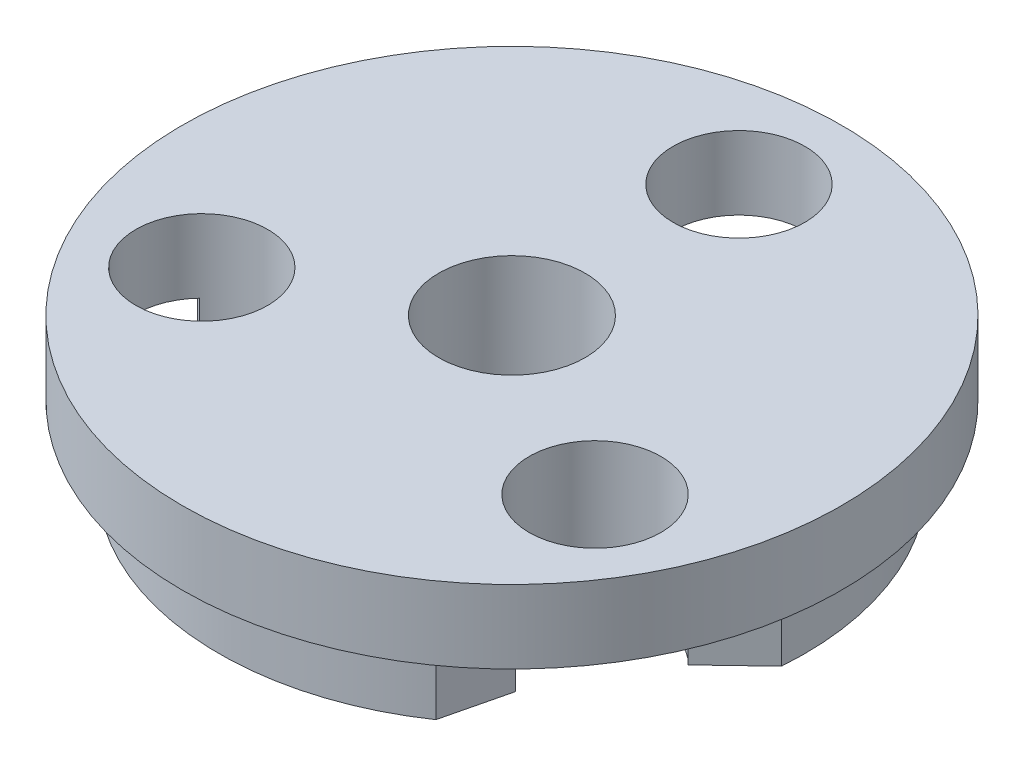
ISO-10303-21;
HEADER;
FILE_DESCRIPTION(('STEP AP214'),'2;1');
FILE_NAME('part.step','',(''),(''),'','','');
FILE_SCHEMA(('AUTOMOTIVE_DESIGN { 1 0 10303 214 1 1 1 1 }'));
ENDSEC;
DATA;
#1=APPLICATION_CONTEXT('core data for automotive mechanical design processes');
#2=APPLICATION_PROTOCOL_DEFINITION('international standard','automotive_design',2000,#1);
#3=PRODUCT_CONTEXT('',#1,'mechanical');
#4=PRODUCT('Part','Part','',(#3));
#5=PRODUCT_RELATED_PRODUCT_CATEGORY('part','',(#4));
#6=PRODUCT_DEFINITION_FORMATION('','',#4);
#7=PRODUCT_DEFINITION_CONTEXT('part definition',#1,'design');
#8=PRODUCT_DEFINITION('design','',#6,#7);
#9=PRODUCT_DEFINITION_SHAPE('','',#8);
#10=(LENGTH_UNIT() NAMED_UNIT(*) SI_UNIT(.MILLI.,.METRE.));
#11=(NAMED_UNIT(*) PLANE_ANGLE_UNIT() SI_UNIT($,.RADIAN.));
#12=(NAMED_UNIT(*) SI_UNIT($,.STERADIAN.) SOLID_ANGLE_UNIT());
#13=UNCERTAINTY_MEASURE_WITH_UNIT(LENGTH_MEASURE(1.E-05),#10,'distance_accuracy_value','');
#14=(GEOMETRIC_REPRESENTATION_CONTEXT(3) GLOBAL_UNCERTAINTY_ASSIGNED_CONTEXT((#13)) GLOBAL_UNIT_ASSIGNED_CONTEXT((#10,
#11,#12)) REPRESENTATION_CONTEXT('',''));
#15=CARTESIAN_POINT('',(0.,0.,0.));
#16=DIRECTION('',(0.,0.,1.));
#17=DIRECTION('',(1.,0.,0.));
#18=AXIS2_PLACEMENT_3D('',#15,#16,#17);
#19=CARTESIAN_POINT('',(0.,-3.5,-15.5));
#20=DIRECTION('',(0.,1.,0.));
#21=DIRECTION('',(0.,0.,1.));
#22=AXIS2_PLACEMENT_3D('',#19,#20,#21);
#23=CYLINDRICAL_SURFACE('',#22,9.);
#24=CARTESIAN_POINT('',(0.,-3.5,-15.5));
#25=DIRECTION('',(0.,-1.,0.));
#26=DIRECTION('',(0.,0.,1.));
#27=AXIS2_PLACEMENT_3D('',#24,#25,#26);
#28=CIRCLE('',#27,9.);
#29=CARTESIAN_POINT('',(8.63404662868259,-3.5,-18.0403225806451));
#30=VERTEX_POINT('',#29);
#31=CARTESIAN_POINT('',(-8.63404662868249,-3.5,-18.0403225806452));
#32=VERTEX_POINT('',#31);
#33=EDGE_CURVE('E150',#30,#32,#28,.T.);
#34=ORIENTED_EDGE('',*,*,#33,.F.);
#35=DIRECTION('',(0.,1.,0.));
#36=VECTOR('',#35,1.);
#37=CARTESIAN_POINT('',(8.63404662868259,-8.5,-18.0403225806451));
#38=LINE('',#37,#36);
#39=CARTESIAN_POINT('',(8.63404662868259,-8.5,-18.0403225806451));
#40=VERTEX_POINT('',#39);
#41=EDGE_CURVE('E11',#40,#30,#38,.T.);
#42=ORIENTED_EDGE('',*,*,#41,.F.);
#43=CARTESIAN_POINT('',(0.,-8.5,-15.5));
#44=DIRECTION('',(0.,-1.,0.));
#45=DIRECTION('',(0.,0.,-1.));
#46=AXIS2_PLACEMENT_3D('',#43,#44,#45);
#47=CIRCLE('',#46,9.);
#48=CARTESIAN_POINT('',(-8.63404662868249,-8.5,-18.0403225806452));
#49=VERTEX_POINT('',#48);
#50=EDGE_CURVE('E181',#49,#40,#47,.F.);
#51=ORIENTED_EDGE('',*,*,#50,.F.);
#52=DIRECTION('',(0.,1.,0.));
#53=VECTOR('',#52,1.);
#54=CARTESIAN_POINT('',(-8.63404662868249,-8.5,-18.0403225806452));
#55=LINE('',#54,#53);
#56=EDGE_CURVE('E190',#49,#32,#55,.T.);
#57=ORIENTED_EDGE('',*,*,#56,.T.);
#58=EDGE_LOOP('',(#34,#42,#51,#57));
#59=FACE_BOUND('',#58,.T.);
#60=ADVANCED_FACE('F35',(#59),#23,.F.);
#61=CARTESIAN_POINT('',(0.,-3.5,0.));
#62=DIRECTION('',(0.,1.,0.));
#63=DIRECTION('',(0.,0.,1.));
#64=AXIS2_PLACEMENT_3D('',#61,#62,#63);
#65=CYLINDRICAL_SURFACE('',#64,5.);
#66=CARTESIAN_POINT('',(0.,-8.5,0.));
#67=DIRECTION('',(0.,-1.,0.));
#68=DIRECTION('',(0.,0.,-1.));
#69=AXIS2_PLACEMENT_3D('',#66,#67,#68);
#70=CIRCLE('',#69,5.);
#71=CARTESIAN_POINT('',(0.,-8.5,-5.));
#72=VERTEX_POINT('',#71);
#73=EDGE_CURVE('E178',#72,#72,#70,.F.);
#74=ORIENTED_EDGE('',*,*,#73,.F.);
#75=EDGE_LOOP('',(#74));
#76=FACE_BOUND('',#75,.T.);
#77=CARTESIAN_POINT('',(0.,1.5,0.));
#78=DIRECTION('',(0.,1.,0.));
#79=DIRECTION('',(0.,0.,1.));
#80=AXIS2_PLACEMENT_3D('',#77,#78,#79);
#81=CIRCLE('',#80,5.);
#82=CARTESIAN_POINT('',(0.,1.5,5.));
#83=VERTEX_POINT('',#82);
#84=EDGE_CURVE('E394',#83,#83,#81,.F.);
#85=ORIENTED_EDGE('',*,*,#84,.F.);
#86=EDGE_LOOP('',(#85));
#87=FACE_BOUND('',#86,.T.);
#88=ADVANCED_FACE('F238',(#76,#87),#65,.F.);
#89=CARTESIAN_POINT('',(0.,-8.5,0.));
#90=DIRECTION('',(0.,1.,0.));
#91=DIRECTION('',(0.,0.,1.));
#92=AXIS2_PLACEMENT_3D('',#89,#90,#91);
#93=CYLINDRICAL_SURFACE('',#92,20.);
#94=CARTESIAN_POINT('',(0.,-3.5,0.));
#95=DIRECTION('',(0.,-1.,0.));
#96=DIRECTION('',(0.,0.,-1.));
#97=AXIS2_PLACEMENT_3D('',#94,#95,#96);
#98=CIRCLE('',#97,20.);
#99=CARTESIAN_POINT('',(19.9404009616461,-3.5,1.54285757242257));
#100=VERTEX_POINT('',#99);
#101=EDGE_CURVE('E176',#30,#100,#98,.T.);
#102=ORIENTED_EDGE('',*,*,#101,.T.);
#103=DIRECTION('',(0.,1.,0.));
#104=VECTOR('',#103,1.);
#105=CARTESIAN_POINT('',(19.9404009616461,-8.5,1.54285757242258));
#106=LINE('',#105,#104);
#107=CARTESIAN_POINT('',(19.9404009616461,-8.5,1.54285757242258));
#108=VERTEX_POINT('',#107);
#109=EDGE_CURVE('E42',#108,#100,#106,.T.);
#110=ORIENTED_EDGE('',*,*,#109,.F.);
#111=CARTESIAN_POINT('',(0.,-8.5,0.));
#112=DIRECTION('',(0.,-1.,0.));
#113=DIRECTION('',(0.,0.,-1.));
#114=AXIS2_PLACEMENT_3D('',#111,#112,#113);
#115=CIRCLE('',#114,20.);
#116=EDGE_CURVE('E183',#40,#108,#115,.T.);
#117=ORIENTED_EDGE('',*,*,#116,.F.);
#118=ORIENTED_EDGE('',*,*,#41,.T.);
#119=EDGE_LOOP('',(#102,#110,#117,#118));
#120=FACE_BOUND('',#119,.T.);
#121=ADVANCED_FACE('F205',(#120),#93,.T.);
#122=CARTESIAN_POINT('',(11.3063543329644,-3.5,16.4974650082204));
#123=VERTEX_POINT('',#122);
#124=CARTESIAN_POINT('',(-11.3063543329626,-3.5,16.4974650082217));
#125=VERTEX_POINT('',#124);
#126=EDGE_CURVE('E189',#123,#125,#98,.T.);
#127=ORIENTED_EDGE('',*,*,#126,.T.);
#128=DIRECTION('',(0.,1.,0.));
#129=VECTOR('',#128,1.);
#130=CARTESIAN_POINT('',(-11.3063543329626,-8.5,16.4974650082217));
#131=LINE('',#130,#129);
#132=CARTESIAN_POINT('',(-11.3063543329626,-8.5,16.4974650082217));
#133=VERTEX_POINT('',#132);
#134=EDGE_CURVE('E195',#133,#125,#131,.T.);
#135=ORIENTED_EDGE('',*,*,#134,.F.);
#136=CARTESIAN_POINT('',(11.3063543329644,-8.5,16.4974650082204));
#137=VERTEX_POINT('',#136);
#138=EDGE_CURVE('E186',#137,#133,#115,.T.);
#139=ORIENTED_EDGE('',*,*,#138,.F.);
#140=DIRECTION('',(0.,1.,0.));
#141=VECTOR('',#140,1.);
#142=CARTESIAN_POINT('',(11.3063543329644,-8.5,16.4974650082204));
#143=LINE('',#142,#141);
#144=EDGE_CURVE('E197',#137,#123,#143,.T.);
#145=ORIENTED_EDGE('',*,*,#144,.T.);
#146=EDGE_LOOP('',(#127,#135,#139,#145));
#147=FACE_BOUND('',#146,.T.);
#148=ADVANCED_FACE('F223',(#147),#93,.T.);
#149=CARTESIAN_POINT('',(-19.9404009616459,-3.5,1.54285757242564));
#150=VERTEX_POINT('',#149);
#151=EDGE_CURVE('E128',#150,#32,#98,.T.);
#152=ORIENTED_EDGE('',*,*,#151,.T.);
#153=ORIENTED_EDGE('',*,*,#56,.F.);
#154=CARTESIAN_POINT('',(-19.9404009616459,-8.5,1.54285757242565));
#155=VERTEX_POINT('',#154);
#156=EDGE_CURVE('E49',#155,#49,#115,.T.);
#157=ORIENTED_EDGE('',*,*,#156,.F.);
#158=DIRECTION('',(0.,1.,0.));
#159=VECTOR('',#158,1.);
#160=CARTESIAN_POINT('',(-19.9404009616459,-8.5,1.54285757242565));
#161=LINE('',#160,#159);
#162=EDGE_CURVE('E193',#155,#150,#161,.T.);
#163=ORIENTED_EDGE('',*,*,#162,.T.);
#164=EDGE_LOOP('',(#152,#153,#157,#163));
#165=FACE_BOUND('',#164,.T.);
#166=ADVANCED_FACE('F219',(#165),#93,.T.);
#167=CARTESIAN_POINT('',(0.,-8.5,0.));
#168=DIRECTION('',(0.,-1.,0.));
#169=DIRECTION('',(0.,0.,-1.));
#170=AXIS2_PLACEMENT_3D('',#167,#168,#169);
#171=PLANE('',#170);
#172=ORIENTED_EDGE('',*,*,#73,.T.);
#173=EDGE_LOOP('',(#172));
#174=FACE_BOUND('',#173,.T.);
#175=ORIENTED_EDGE('',*,*,#50,.T.);
#176=ORIENTED_EDGE('',*,*,#116,.T.);
#177=DIRECTION('',(0.724111911442924,0.,-0.689682491952982));
#178=VECTOR('',#177,1.);
#179=CARTESIAN_POINT('',(10.2554041460978,-8.5,10.767360902293));
#180=LINE('',#179,#178);
#181=CARTESIAN_POINT('',(16.681897360153,-8.5,4.646428786211));
#182=VERTEX_POINT('',#181);
#183=EDGE_CURVE('E157',#182,#108,#180,.T.);
#184=ORIENTED_EDGE('',*,*,#183,.F.);
#185=CARTESIAN_POINT('',(13.4233937586598,-8.5,7.74999999999943));
#186=DIRECTION('',(0.,-1.,0.));
#187=DIRECTION('',(0.,0.,-1.));
#188=AXIS2_PLACEMENT_3D('',#185,#186,#187);
#189=CIRCLE('',#188,4.5);
#190=CARTESIAN_POINT('',(12.3648740458121,-8.5,12.1237325041099));
#191=VERTEX_POINT('',#190);
#192=EDGE_CURVE('E152',#191,#182,#189,.T.);
#193=ORIENTED_EDGE('',*,*,#192,.F.);
#194=DIRECTION('',(0.235226602855052,0.,-0.971940556469001));
#195=VECTOR('',#194,1.);
#196=CARTESIAN_POINT('',(14.4525101461504,-8.5,3.49776006544858));
#197=LINE('',#196,#195);
#198=EDGE_CURVE('E163',#137,#191,#197,.T.);
#199=ORIENTED_EDGE('',*,*,#198,.F.);
#200=ORIENTED_EDGE('',*,*,#138,.T.);
#201=DIRECTION('',(0.23522660285502,0.,0.971940556469009));
#202=VECTOR('',#201,1.);
#203=CARTESIAN_POINT('',(-14.4525101461487,-8.5,3.49776006544766));
#204=LINE('',#203,#202);
#205=CARTESIAN_POINT('',(-12.3648740458102,-8.5,12.1237325041111));
#206=VERTEX_POINT('',#205);
#207=EDGE_CURVE('E129',#206,#133,#204,.T.);
#208=ORIENTED_EDGE('',*,*,#207,.F.);
#209=CARTESIAN_POINT('',(-13.4233937586578,-8.5,7.75000000000058));
#210=DIRECTION('',(0.,-1.,0.));
#211=DIRECTION('',(0.,0.,-1.));
#212=AXIS2_PLACEMENT_3D('',#209,#210,#211);
#213=CIRCLE('',#212,4.5);
#214=CARTESIAN_POINT('',(-16.6818973601518,-8.5,4.64642878621312));
#215=VERTEX_POINT('',#214);
#216=EDGE_CURVE('E169',#215,#206,#213,.T.);
#217=ORIENTED_EDGE('',*,*,#216,.F.);
#218=DIRECTION('',(0.724111911443126,0.,0.689682491952769));
#219=VECTOR('',#218,1.);
#220=CARTESIAN_POINT('',(-10.2554041460933,-8.5,10.7673609022947));
#221=LINE('',#220,#219);
#222=EDGE_CURVE('E54',#155,#215,#221,.T.);
#223=ORIENTED_EDGE('',*,*,#222,.F.);
#224=ORIENTED_EDGE('',*,*,#156,.T.);
#225=EDGE_LOOP('',(#175,#176,#184,#193,#199,#200,#208,#217,#223,#224));
#226=FACE_BOUND('',#225,.T.);
#227=ADVANCED_FACE('F213',(#174,#226),#171,.T.);
#228=CARTESIAN_POINT('',(-13.4233937586578,-3.5,7.75000000000058));
#229=DIRECTION('',(0.,-1.,0.));
#230=DIRECTION('',(0.,0.,-1.));
#231=AXIS2_PLACEMENT_3D('',#228,#229,#230);
#232=CYLINDRICAL_SURFACE('',#231,4.5);
#233=ORIENTED_EDGE('',*,*,#216,.T.);
#234=DIRECTION('',(0.,-1.,0.));
#235=VECTOR('',#234,1.);
#236=CARTESIAN_POINT('',(-12.3648740458102,-3.5,12.1237325041111));
#237=LINE('',#236,#235);
#238=CARTESIAN_POINT('',(-12.3648740458102,-3.5,12.1237325041111));
#239=VERTEX_POINT('',#238);
#240=EDGE_CURVE('E118',#239,#206,#237,.T.);
#241=ORIENTED_EDGE('',*,*,#240,.F.);
#242=CARTESIAN_POINT('',(-13.4233937586578,-3.5,7.75000000000058));
#243=DIRECTION('',(0.,1.,0.));
#244=DIRECTION('',(0.,0.,1.));
#245=AXIS2_PLACEMENT_3D('',#242,#243,#244);
#246=CIRCLE('',#245,4.5);
#247=CARTESIAN_POINT('',(-16.6818973601518,-3.5,4.64642878621311));
#248=VERTEX_POINT('',#247);
#249=EDGE_CURVE('E126',#239,#248,#246,.F.);
#250=ORIENTED_EDGE('',*,*,#249,.T.);
#251=DIRECTION('',(0.,-1.,0.));
#252=VECTOR('',#251,1.);
#253=CARTESIAN_POINT('',(-16.6818973601518,-3.5,4.64642878621312));
#254=LINE('',#253,#252);
#255=EDGE_CURVE('E110',#248,#215,#254,.T.);
#256=ORIENTED_EDGE('',*,*,#255,.T.);
#257=EDGE_LOOP('',(#233,#241,#250,#256));
#258=FACE_BOUND('',#257,.T.);
#259=CARTESIAN_POINT('',(-13.4233937586578,1.5,7.75000000000058));
#260=DIRECTION('',(0.,1.,0.));
#261=DIRECTION('',(0.,0.,1.));
#262=AXIS2_PLACEMENT_3D('',#259,#260,#261);
#263=CIRCLE('',#262,4.5);
#264=CARTESIAN_POINT('',(-13.4233937586578,1.5,12.2500000000006));
#265=VERTEX_POINT('',#264);
#266=EDGE_CURVE('E149',#265,#265,#263,.F.);
#267=ORIENTED_EDGE('',*,*,#266,.F.);
#268=EDGE_LOOP('',(#267));
#269=FACE_BOUND('',#268,.T.);
#270=ADVANCED_FACE('F132',(#258,#269),#232,.F.);
#271=CARTESIAN_POINT('',(-14.4525101461487,-3.5,3.49776006544766));
#272=DIRECTION('',(0.971940556469009,0.,-0.23522660285502));
#273=DIRECTION('',(-0.23522660285502,0.,-0.971940556469009));
#274=AXIS2_PLACEMENT_3D('',#271,#272,#273);
#275=PLANE('',#274);
#276=ORIENTED_EDGE('',*,*,#207,.T.);
#277=ORIENTED_EDGE('',*,*,#134,.T.);
#278=DIRECTION('',(0.23522660285502,0.,0.971940556469009));
#279=VECTOR('',#278,1.);
#280=CARTESIAN_POINT('',(-14.4525101461487,-3.5,3.49776006544766));
#281=LINE('',#280,#279);
#282=EDGE_CURVE('E119',#239,#125,#281,.T.);
#283=ORIENTED_EDGE('',*,*,#282,.F.);
#284=ORIENTED_EDGE('',*,*,#240,.T.);
#285=EDGE_LOOP('',(#276,#277,#283,#284));
#286=FACE_BOUND('',#285,.T.);
#287=ADVANCED_FACE('F226',(#286),#275,.F.);
#288=CARTESIAN_POINT('',(-10.2554041460933,-3.5,10.7673609022947));
#289=DIRECTION('',(0.689682491952769,0.,-0.724111911443126));
#290=DIRECTION('',(-0.724111911443126,0.,-0.689682491952769));
#291=AXIS2_PLACEMENT_3D('',#288,#289,#290);
#292=PLANE('',#291);
#293=ORIENTED_EDGE('',*,*,#222,.T.);
#294=ORIENTED_EDGE('',*,*,#255,.F.);
#295=DIRECTION('',(0.724111911443126,0.,0.689682491952769));
#296=VECTOR('',#295,1.);
#297=CARTESIAN_POINT('',(-10.2554041460933,-3.5,10.7673609022947));
#298=LINE('',#297,#296);
#299=EDGE_CURVE('E113',#150,#248,#298,.T.);
#300=ORIENTED_EDGE('',*,*,#299,.F.);
#301=ORIENTED_EDGE('',*,*,#162,.F.);
#302=EDGE_LOOP('',(#293,#294,#300,#301));
#303=FACE_BOUND('',#302,.T.);
#304=ADVANCED_FACE('F112',(#303),#292,.F.);
#305=CARTESIAN_POINT('',(13.4233937586598,-3.5,7.74999999999943));
#306=DIRECTION('',(0.,-1.,0.));
#307=DIRECTION('',(0.,0.,-1.));
#308=AXIS2_PLACEMENT_3D('',#305,#306,#307);
#309=CYLINDRICAL_SURFACE('',#308,4.5);
#310=ORIENTED_EDGE('',*,*,#192,.T.);
#311=DIRECTION('',(0.,-1.,0.));
#312=VECTOR('',#311,1.);
#313=CARTESIAN_POINT('',(16.681897360153,-3.5,4.646428786211));
#314=LINE('',#313,#312);
#315=CARTESIAN_POINT('',(16.681897360153,-3.5,4.646428786211));
#316=VERTEX_POINT('',#315);
#317=EDGE_CURVE('E166',#316,#182,#314,.T.);
#318=ORIENTED_EDGE('',*,*,#317,.F.);
#319=CARTESIAN_POINT('',(13.4233937586598,-3.5,7.74999999999943));
#320=DIRECTION('',(0.,1.,0.));
#321=DIRECTION('',(0.,0.,1.));
#322=AXIS2_PLACEMENT_3D('',#319,#320,#321);
#323=CIRCLE('',#322,4.5);
#324=CARTESIAN_POINT('',(12.3648740458121,-3.5,12.1237325041099));
#325=VERTEX_POINT('',#324);
#326=EDGE_CURVE('E135',#316,#325,#323,.F.);
#327=ORIENTED_EDGE('',*,*,#326,.T.);
#328=DIRECTION('',(0.,-1.,0.));
#329=VECTOR('',#328,1.);
#330=CARTESIAN_POINT('',(12.3648740458121,-3.5,12.1237325041099));
#331=LINE('',#330,#329);
#332=EDGE_CURVE('E160',#325,#191,#331,.T.);
#333=ORIENTED_EDGE('',*,*,#332,.T.);
#334=EDGE_LOOP('',(#310,#318,#327,#333));
#335=FACE_BOUND('',#334,.T.);
#336=CARTESIAN_POINT('',(13.4233937586598,1.5,7.74999999999943));
#337=DIRECTION('',(0.,1.,0.));
#338=DIRECTION('',(0.,0.,1.));
#339=AXIS2_PLACEMENT_3D('',#336,#337,#338);
#340=CIRCLE('',#339,4.5);
#341=CARTESIAN_POINT('',(13.4233937586598,1.5,12.2499999999994));
#342=VERTEX_POINT('',#341);
#343=EDGE_CURVE('E390',#342,#342,#340,.F.);
#344=ORIENTED_EDGE('',*,*,#343,.F.);
#345=EDGE_LOOP('',(#344));
#346=FACE_BOUND('',#345,.T.);
#347=ADVANCED_FACE('F210',(#335,#346),#309,.F.);
#348=CARTESIAN_POINT('',(10.2554041460978,-3.5,10.767360902293));
#349=DIRECTION('',(-0.689682491952982,0.,-0.724111911442924));
#350=DIRECTION('',(-0.724111911442924,0.,0.689682491952982));
#351=AXIS2_PLACEMENT_3D('',#348,#349,#350);
#352=PLANE('',#351);
#353=ORIENTED_EDGE('',*,*,#183,.T.);
#354=ORIENTED_EDGE('',*,*,#109,.T.);
#355=DIRECTION('',(0.724111911442924,0.,-0.689682491952982));
#356=VECTOR('',#355,1.);
#357=CARTESIAN_POINT('',(10.2554041460978,-3.5,10.767360902293));
#358=LINE('',#357,#356);
#359=EDGE_CURVE('E156',#316,#100,#358,.T.);
#360=ORIENTED_EDGE('',*,*,#359,.F.);
#361=ORIENTED_EDGE('',*,*,#317,.T.);
#362=EDGE_LOOP('',(#353,#354,#360,#361));
#363=FACE_BOUND('',#362,.T.);
#364=ADVANCED_FACE('F201',(#363),#352,.F.);
#365=CARTESIAN_POINT('',(14.4525101461504,-3.5,3.49776006544858));
#366=DIRECTION('',(-0.971940556469001,0.,-0.235226602855052));
#367=DIRECTION('',(-0.235226602855052,0.,0.971940556469001));
#368=AXIS2_PLACEMENT_3D('',#365,#366,#367);
#369=PLANE('',#368);
#370=ORIENTED_EDGE('',*,*,#198,.T.);
#371=ORIENTED_EDGE('',*,*,#332,.F.);
#372=DIRECTION('',(0.235226602855052,0.,-0.971940556469001));
#373=VECTOR('',#372,1.);
#374=CARTESIAN_POINT('',(14.4525101461504,-3.5,3.49776006544858));
#375=LINE('',#374,#373);
#376=EDGE_CURVE('E153',#123,#325,#375,.T.);
#377=ORIENTED_EDGE('',*,*,#376,.F.);
#378=ORIENTED_EDGE('',*,*,#144,.F.);
#379=EDGE_LOOP('',(#370,#371,#377,#378));
#380=FACE_BOUND('',#379,.T.);
#381=ADVANCED_FACE('F280',(#380),#369,.F.);
#382=CARTESIAN_POINT('',(0.,-3.5,0.));
#383=DIRECTION('',(0.,1.,0.));
#384=DIRECTION('',(0.,0.,1.));
#385=AXIS2_PLACEMENT_3D('',#382,#383,#384);
#386=PLANE('',#385);
#387=CARTESIAN_POINT('',(0.,-3.5,0.));
#388=DIRECTION('',(0.,1.,0.));
#389=DIRECTION('',(0.,0.,1.));
#390=AXIS2_PLACEMENT_3D('',#387,#388,#389);
#391=CIRCLE('',#390,22.5);
#392=CARTESIAN_POINT('',(0.,-3.5,22.5));
#393=VERTEX_POINT('',#392);
#394=EDGE_CURVE('E146',#393,#393,#391,.T.);
#395=ORIENTED_EDGE('',*,*,#394,.F.);
#396=EDGE_LOOP('',(#395));
#397=FACE_BOUND('',#396,.T.);
#398=CARTESIAN_POINT('',(0.,-3.5,-15.5));
#399=DIRECTION('',(0.,1.,0.));
#400=DIRECTION('',(0.,0.,1.));
#401=AXIS2_PLACEMENT_3D('',#398,#399,#400);
#402=CIRCLE('',#401,4.5);
#403=CARTESIAN_POINT('',(0.,-3.5,-11.));
#404=VERTEX_POINT('',#403);
#405=EDGE_CURVE('E138',#404,#404,#402,.T.);
#406=ORIENTED_EDGE('',*,*,#405,.T.);
#407=EDGE_LOOP('',(#406));
#408=FACE_BOUND('',#407,.T.);
#409=ORIENTED_EDGE('',*,*,#249,.F.);
#410=ORIENTED_EDGE('',*,*,#282,.T.);
#411=ORIENTED_EDGE('',*,*,#126,.F.);
#412=ORIENTED_EDGE('',*,*,#376,.T.);
#413=ORIENTED_EDGE('',*,*,#326,.F.);
#414=ORIENTED_EDGE('',*,*,#359,.T.);
#415=ORIENTED_EDGE('',*,*,#101,.F.);
#416=ORIENTED_EDGE('',*,*,#33,.T.);
#417=ORIENTED_EDGE('',*,*,#151,.F.);
#418=ORIENTED_EDGE('',*,*,#299,.T.);
#419=EDGE_LOOP('',(#409,#410,#411,#412,#413,#414,#415,#416,#417,#418));
#420=FACE_BOUND('',#419,.T.);
#421=ADVANCED_FACE('F124',(#397,#408,#420),#386,.F.);
#422=CARTESIAN_POINT('',(0.,1.5,-15.5));
#423=DIRECTION('',(0.,-1.,0.));
#424=DIRECTION('',(0.,0.,-1.));
#425=AXIS2_PLACEMENT_3D('',#422,#423,#424);
#426=CYLINDRICAL_SURFACE('',#425,4.5);
#427=CARTESIAN_POINT('',(0.,1.5,-15.5));
#428=DIRECTION('',(0.,1.,0.));
#429=DIRECTION('',(0.,0.,1.));
#430=AXIS2_PLACEMENT_3D('',#427,#428,#429);
#431=CIRCLE('',#430,4.5);
#432=CARTESIAN_POINT('',(0.,1.5,-11.));
#433=VERTEX_POINT('',#432);
#434=EDGE_CURVE('E398',#433,#433,#431,.T.);
#435=ORIENTED_EDGE('',*,*,#434,.T.);
#436=EDGE_LOOP('',(#435));
#437=FACE_BOUND('',#436,.T.);
#438=ORIENTED_EDGE('',*,*,#405,.F.);
#439=EDGE_LOOP('',(#438));
#440=FACE_BOUND('',#439,.T.);
#441=ADVANCED_FACE('F343',(#437,#440),#426,.F.);
#442=CARTESIAN_POINT('',(0.,1.5,0.));
#443=DIRECTION('',(0.,-1.,0.));
#444=DIRECTION('',(0.,0.,-1.));
#445=AXIS2_PLACEMENT_3D('',#442,#443,#444);
#446=CYLINDRICAL_SURFACE('',#445,22.5);
#447=CARTESIAN_POINT('',(0.,1.5,0.));
#448=DIRECTION('',(0.,1.,0.));
#449=DIRECTION('',(0.,0.,1.));
#450=AXIS2_PLACEMENT_3D('',#447,#448,#449);
#451=CIRCLE('',#450,22.5);
#452=CARTESIAN_POINT('',(0.,1.5,22.5));
#453=VERTEX_POINT('',#452);
#454=EDGE_CURVE('E141',#453,#453,#451,.T.);
#455=ORIENTED_EDGE('',*,*,#454,.F.);
#456=EDGE_LOOP('',(#455));
#457=FACE_BOUND('',#456,.T.);
#458=ORIENTED_EDGE('',*,*,#394,.T.);
#459=EDGE_LOOP('',(#458));
#460=FACE_BOUND('',#459,.T.);
#461=ADVANCED_FACE('F355',(#457,#460),#446,.T.);
#462=CARTESIAN_POINT('',(0.,1.5,0.));
#463=DIRECTION('',(0.,1.,0.));
#464=DIRECTION('',(0.,0.,1.));
#465=AXIS2_PLACEMENT_3D('',#462,#463,#464);
#466=PLANE('',#465);
#467=ORIENTED_EDGE('',*,*,#266,.T.);
#468=EDGE_LOOP('',(#467));
#469=FACE_BOUND('',#468,.T.);
#470=ORIENTED_EDGE('',*,*,#343,.T.);
#471=EDGE_LOOP('',(#470));
#472=FACE_BOUND('',#471,.T.);
#473=ORIENTED_EDGE('',*,*,#84,.T.);
#474=EDGE_LOOP('',(#473));
#475=FACE_BOUND('',#474,.T.);
#476=ORIENTED_EDGE('',*,*,#434,.F.);
#477=EDGE_LOOP('',(#476));
#478=FACE_BOUND('',#477,.T.);
#479=ORIENTED_EDGE('',*,*,#454,.T.);
#480=EDGE_LOOP('',(#479));
#481=FACE_BOUND('',#480,.T.);
#482=ADVANCED_FACE('F364',(#469,#472,#475,#478,#481),#466,.T.);
#483=CLOSED_SHELL('',(#60,#88,#121,#148,#166,#227,#270,#287,#304,#347,#364,#381,#421,#441,#461,#482));
#484=MANIFOLD_SOLID_BREP('B2',#483);
#485=ADVANCED_BREP_SHAPE_REPRESENTATION('',(#18,#484),#14);
#486=SHAPE_DEFINITION_REPRESENTATION(#9,#485);
ENDSEC;
END-ISO-10303-21;
